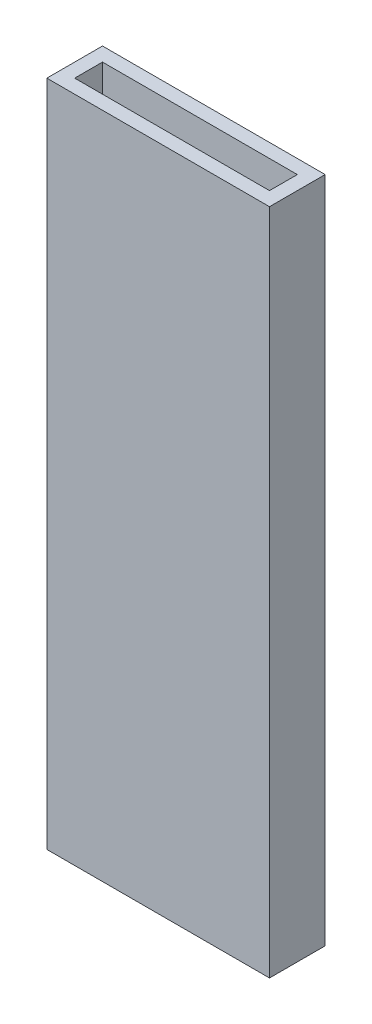
ISO-10303-21;
HEADER;
FILE_DESCRIPTION(('STEP AP214'),'2;1');
FILE_NAME('part.step','',(''),(''),'','','');
FILE_SCHEMA(('AUTOMOTIVE_DESIGN { 1 0 10303 214 1 1 1 1 }'));
ENDSEC;
DATA;
#1=APPLICATION_CONTEXT('core data for automotive mechanical design processes');
#2=APPLICATION_PROTOCOL_DEFINITION('international standard','automotive_design',2000,#1);
#3=PRODUCT_CONTEXT('',#1,'mechanical');
#4=PRODUCT('Part','Part','',(#3));
#5=PRODUCT_RELATED_PRODUCT_CATEGORY('part','',(#4));
#6=PRODUCT_DEFINITION_FORMATION('','',#4);
#7=PRODUCT_DEFINITION_CONTEXT('part definition',#1,'design');
#8=PRODUCT_DEFINITION('design','',#6,#7);
#9=PRODUCT_DEFINITION_SHAPE('','',#8);
#10=(LENGTH_UNIT() NAMED_UNIT(*) SI_UNIT(.MILLI.,.METRE.));
#11=(NAMED_UNIT(*) PLANE_ANGLE_UNIT() SI_UNIT($,.RADIAN.));
#12=(NAMED_UNIT(*) SI_UNIT($,.STERADIAN.) SOLID_ANGLE_UNIT());
#13=UNCERTAINTY_MEASURE_WITH_UNIT(LENGTH_MEASURE(1.E-05),#10,'distance_accuracy_value','');
#14=(GEOMETRIC_REPRESENTATION_CONTEXT(3) GLOBAL_UNCERTAINTY_ASSIGNED_CONTEXT((#13)) GLOBAL_UNIT_ASSIGNED_CONTEXT((#10,
#11,#12)) REPRESENTATION_CONTEXT('',''));
#15=CARTESIAN_POINT('',(0.,0.,0.));
#16=DIRECTION('',(0.,0.,1.));
#17=DIRECTION('',(1.,0.,0.));
#18=AXIS2_PLACEMENT_3D('',#15,#16,#17);
#19=CARTESIAN_POINT('',(0.,76.2,0.));
#20=DIRECTION('',(0.,-1.,0.));
#21=DIRECTION('',(0.,0.,-1.));
#22=AXIS2_PLACEMENT_3D('',#19,#20,#21);
#23=PLANE('',#22);
#24=DIRECTION('',(0.,0.,1.));
#25=VECTOR('',#24,1.);
#26=CARTESIAN_POINT('',(0.,76.2,0.));
#27=LINE('',#26,#25);
#28=CARTESIAN_POINT('',(0.,76.2,-6.35));
#29=VERTEX_POINT('',#28);
#30=CARTESIAN_POINT('',(0.,76.2,0.));
#31=VERTEX_POINT('',#30);
#32=EDGE_CURVE('E129',#29,#31,#27,.T.);
#33=ORIENTED_EDGE('',*,*,#32,.T.);
#34=DIRECTION('',(1.,0.,0.));
#35=VECTOR('',#34,1.);
#36=CARTESIAN_POINT('',(0.,76.2,0.));
#37=LINE('',#36,#35);
#38=CARTESIAN_POINT('',(25.4,76.2,0.));
#39=VERTEX_POINT('',#38);
#40=EDGE_CURVE('E132',#31,#39,#37,.T.);
#41=ORIENTED_EDGE('',*,*,#40,.T.);
#42=DIRECTION('',(0.,0.,-1.));
#43=VECTOR('',#42,1.);
#44=CARTESIAN_POINT('',(25.4,76.2,0.));
#45=LINE('',#44,#43);
#46=CARTESIAN_POINT('',(25.4,76.2,-6.35));
#47=VERTEX_POINT('',#46);
#48=EDGE_CURVE('E135',#39,#47,#45,.T.);
#49=ORIENTED_EDGE('',*,*,#48,.T.);
#50=DIRECTION('',(-1.,0.,0.));
#51=VECTOR('',#50,1.);
#52=CARTESIAN_POINT('',(0.,76.2,-6.35));
#53=LINE('',#52,#51);
#54=EDGE_CURVE('E137',#47,#29,#53,.T.);
#55=ORIENTED_EDGE('',*,*,#54,.T.);
#56=EDGE_LOOP('',(#33,#41,#49,#55));
#57=FACE_BOUND('',#56,.T.);
#58=DIRECTION('',(0.,0.,1.));
#59=VECTOR('',#58,1.);
#60=CARTESIAN_POINT('',(1.5875,76.2,0.));
#61=LINE('',#60,#59);
#62=CARTESIAN_POINT('',(1.5875,76.2,-4.7625));
#63=VERTEX_POINT('',#62);
#64=CARTESIAN_POINT('',(1.5875,76.2,-1.5875));
#65=VERTEX_POINT('',#64);
#66=EDGE_CURVE('E117',#63,#65,#61,.T.);
#67=ORIENTED_EDGE('',*,*,#66,.F.);
#68=DIRECTION('',(-1.,0.,0.));
#69=VECTOR('',#68,1.);
#70=CARTESIAN_POINT('',(0.,76.2,-4.7625));
#71=LINE('',#70,#69);
#72=CARTESIAN_POINT('',(23.8125,76.2,-4.7625));
#73=VERTEX_POINT('',#72);
#74=EDGE_CURVE('E102',#73,#63,#71,.T.);
#75=ORIENTED_EDGE('',*,*,#74,.F.);
#76=DIRECTION('',(0.,0.,-1.));
#77=VECTOR('',#76,1.);
#78=CARTESIAN_POINT('',(23.8125,76.2,0.));
#79=LINE('',#78,#77);
#80=CARTESIAN_POINT('',(23.8125,76.2,-1.5875));
#81=VERTEX_POINT('',#80);
#82=EDGE_CURVE('E126',#81,#73,#79,.T.);
#83=ORIENTED_EDGE('',*,*,#82,.F.);
#84=DIRECTION('',(1.,0.,0.));
#85=VECTOR('',#84,1.);
#86=CARTESIAN_POINT('',(0.,76.2,-1.5875));
#87=LINE('',#86,#85);
#88=EDGE_CURVE('E119',#65,#81,#87,.T.);
#89=ORIENTED_EDGE('',*,*,#88,.F.);
#90=EDGE_LOOP('',(#67,#75,#83,#89));
#91=FACE_BOUND('',#90,.T.);
#92=ADVANCED_FACE('F32',(#57,#91),#23,.F.);
#93=CARTESIAN_POINT('',(0.,0.,0.));
#94=DIRECTION('',(0.,-1.,0.));
#95=DIRECTION('',(0.,0.,-1.));
#96=AXIS2_PLACEMENT_3D('',#93,#94,#95);
#97=PLANE('',#96);
#98=DIRECTION('',(0.,0.,1.));
#99=VECTOR('',#98,1.);
#100=CARTESIAN_POINT('',(0.,0.,0.));
#101=LINE('',#100,#99);
#102=CARTESIAN_POINT('',(0.,0.,-6.35));
#103=VERTEX_POINT('',#102);
#104=CARTESIAN_POINT('',(0.,0.,0.));
#105=VERTEX_POINT('',#104);
#106=EDGE_CURVE('E140',#103,#105,#101,.T.);
#107=ORIENTED_EDGE('',*,*,#106,.F.);
#108=DIRECTION('',(-1.,0.,0.));
#109=VECTOR('',#108,1.);
#110=CARTESIAN_POINT('',(0.,0.,-6.35));
#111=LINE('',#110,#109);
#112=CARTESIAN_POINT('',(25.4,0.,-6.35));
#113=VERTEX_POINT('',#112);
#114=EDGE_CURVE('E133',#113,#103,#111,.T.);
#115=ORIENTED_EDGE('',*,*,#114,.F.);
#116=DIRECTION('',(0.,0.,-1.));
#117=VECTOR('',#116,1.);
#118=CARTESIAN_POINT('',(25.4,0.,0.));
#119=LINE('',#118,#117);
#120=CARTESIAN_POINT('',(25.4,0.,0.));
#121=VERTEX_POINT('',#120);
#122=EDGE_CURVE('E145',#121,#113,#119,.T.);
#123=ORIENTED_EDGE('',*,*,#122,.F.);
#124=DIRECTION('',(1.,0.,0.));
#125=VECTOR('',#124,1.);
#126=CARTESIAN_POINT('',(0.,0.,0.));
#127=LINE('',#126,#125);
#128=EDGE_CURVE('E143',#105,#121,#127,.T.);
#129=ORIENTED_EDGE('',*,*,#128,.F.);
#130=EDGE_LOOP('',(#107,#115,#123,#129));
#131=FACE_BOUND('',#130,.T.);
#132=DIRECTION('',(-1.,0.,0.));
#133=VECTOR('',#132,1.);
#134=CARTESIAN_POINT('',(0.,0.,-4.7625));
#135=LINE('',#134,#133);
#136=CARTESIAN_POINT('',(23.8125,0.,-4.7625));
#137=VERTEX_POINT('',#136);
#138=CARTESIAN_POINT('',(1.5875,0.,-4.7625));
#139=VERTEX_POINT('',#138);
#140=EDGE_CURVE('E100',#137,#139,#135,.T.);
#141=ORIENTED_EDGE('',*,*,#140,.T.);
#142=DIRECTION('',(0.,0.,1.));
#143=VECTOR('',#142,1.);
#144=CARTESIAN_POINT('',(1.5875,0.,0.));
#145=LINE('',#144,#143);
#146=CARTESIAN_POINT('',(1.5875,0.,-1.5875));
#147=VERTEX_POINT('',#146);
#148=EDGE_CURVE('E108',#139,#147,#145,.T.);
#149=ORIENTED_EDGE('',*,*,#148,.T.);
#150=DIRECTION('',(1.,0.,0.));
#151=VECTOR('',#150,1.);
#152=CARTESIAN_POINT('',(0.,0.,-1.5875));
#153=LINE('',#152,#151);
#154=CARTESIAN_POINT('',(23.8125,0.,-1.5875));
#155=VERTEX_POINT('',#154);
#156=EDGE_CURVE('E114',#147,#155,#153,.T.);
#157=ORIENTED_EDGE('',*,*,#156,.T.);
#158=DIRECTION('',(0.,0.,-1.));
#159=VECTOR('',#158,1.);
#160=CARTESIAN_POINT('',(23.8125,0.,0.));
#161=LINE('',#160,#159);
#162=EDGE_CURVE('E54',#155,#137,#161,.T.);
#163=ORIENTED_EDGE('',*,*,#162,.T.);
#164=EDGE_LOOP('',(#141,#149,#157,#163));
#165=FACE_BOUND('',#164,.T.);
#166=ADVANCED_FACE('F116',(#131,#165),#97,.T.);
#167=CARTESIAN_POINT('',(0.,76.2,0.));
#168=DIRECTION('',(1.,0.,0.));
#169=DIRECTION('',(0.,0.,-1.));
#170=AXIS2_PLACEMENT_3D('',#167,#168,#169);
#171=PLANE('',#170);
#172=ORIENTED_EDGE('',*,*,#106,.T.);
#173=DIRECTION('',(0.,-1.,0.));
#174=VECTOR('',#173,1.);
#175=CARTESIAN_POINT('',(0.,76.2,0.));
#176=LINE('',#175,#174);
#177=EDGE_CURVE('E11',#31,#105,#176,.T.);
#178=ORIENTED_EDGE('',*,*,#177,.F.);
#179=ORIENTED_EDGE('',*,*,#32,.F.);
#180=DIRECTION('',(0.,-1.,0.));
#181=VECTOR('',#180,1.);
#182=CARTESIAN_POINT('',(0.,76.2,-6.35));
#183=LINE('',#182,#181);
#184=EDGE_CURVE('E139',#29,#103,#183,.T.);
#185=ORIENTED_EDGE('',*,*,#184,.T.);
#186=EDGE_LOOP('',(#172,#178,#179,#185));
#187=FACE_BOUND('',#186,.T.);
#188=ADVANCED_FACE('F34',(#187),#171,.F.);
#189=CARTESIAN_POINT('',(0.,76.2,0.));
#190=DIRECTION('',(0.,0.,-1.));
#191=DIRECTION('',(-1.,0.,0.));
#192=AXIS2_PLACEMENT_3D('',#189,#190,#191);
#193=PLANE('',#192);
#194=ORIENTED_EDGE('',*,*,#128,.T.);
#195=DIRECTION('',(0.,-1.,0.));
#196=VECTOR('',#195,1.);
#197=CARTESIAN_POINT('',(25.4,76.2,0.));
#198=LINE('',#197,#196);
#199=EDGE_CURVE('E40',#39,#121,#198,.T.);
#200=ORIENTED_EDGE('',*,*,#199,.F.);
#201=ORIENTED_EDGE('',*,*,#40,.F.);
#202=ORIENTED_EDGE('',*,*,#177,.T.);
#203=EDGE_LOOP('',(#194,#200,#201,#202));
#204=FACE_BOUND('',#203,.T.);
#205=ADVANCED_FACE('F172',(#204),#193,.F.);
#206=CARTESIAN_POINT('',(25.4,76.2,0.));
#207=DIRECTION('',(-1.,0.,0.));
#208=DIRECTION('',(0.,0.,1.));
#209=AXIS2_PLACEMENT_3D('',#206,#207,#208);
#210=PLANE('',#209);
#211=ORIENTED_EDGE('',*,*,#122,.T.);
#212=DIRECTION('',(0.,-1.,0.));
#213=VECTOR('',#212,1.);
#214=CARTESIAN_POINT('',(25.4,76.2,-6.35));
#215=LINE('',#214,#213);
#216=EDGE_CURVE('E150',#47,#113,#215,.T.);
#217=ORIENTED_EDGE('',*,*,#216,.F.);
#218=ORIENTED_EDGE('',*,*,#48,.F.);
#219=ORIENTED_EDGE('',*,*,#199,.T.);
#220=EDGE_LOOP('',(#211,#217,#218,#219));
#221=FACE_BOUND('',#220,.T.);
#222=ADVANCED_FACE('F157',(#221),#210,.F.);
#223=CARTESIAN_POINT('',(0.,76.2,-6.35));
#224=DIRECTION('',(0.,0.,1.));
#225=DIRECTION('',(1.,0.,0.));
#226=AXIS2_PLACEMENT_3D('',#223,#224,#225);
#227=PLANE('',#226);
#228=ORIENTED_EDGE('',*,*,#114,.T.);
#229=ORIENTED_EDGE('',*,*,#184,.F.);
#230=ORIENTED_EDGE('',*,*,#54,.F.);
#231=ORIENTED_EDGE('',*,*,#216,.T.);
#232=EDGE_LOOP('',(#228,#229,#230,#231));
#233=FACE_BOUND('',#232,.T.);
#234=ADVANCED_FACE('F165',(#233),#227,.F.);
#235=CARTESIAN_POINT('',(1.5875,76.2,0.));
#236=DIRECTION('',(1.,0.,0.));
#237=DIRECTION('',(0.,0.,-1.));
#238=AXIS2_PLACEMENT_3D('',#235,#236,#237);
#239=PLANE('',#238);
#240=ORIENTED_EDGE('',*,*,#148,.F.);
#241=DIRECTION('',(0.,-1.,0.));
#242=VECTOR('',#241,1.);
#243=CARTESIAN_POINT('',(1.5875,76.2,-4.7625));
#244=LINE('',#243,#242);
#245=EDGE_CURVE('E96',#63,#139,#244,.T.);
#246=ORIENTED_EDGE('',*,*,#245,.F.);
#247=ORIENTED_EDGE('',*,*,#66,.T.);
#248=DIRECTION('',(0.,-1.,0.));
#249=VECTOR('',#248,1.);
#250=CARTESIAN_POINT('',(1.5875,76.2,-1.5875));
#251=LINE('',#250,#249);
#252=EDGE_CURVE('E111',#65,#147,#251,.T.);
#253=ORIENTED_EDGE('',*,*,#252,.T.);
#254=EDGE_LOOP('',(#240,#246,#247,#253));
#255=FACE_BOUND('',#254,.T.);
#256=ADVANCED_FACE('F109',(#255),#239,.T.);
#257=CARTESIAN_POINT('',(0.,76.2,-1.5875));
#258=DIRECTION('',(0.,0.,-1.));
#259=DIRECTION('',(-1.,0.,0.));
#260=AXIS2_PLACEMENT_3D('',#257,#258,#259);
#261=PLANE('',#260);
#262=ORIENTED_EDGE('',*,*,#156,.F.);
#263=ORIENTED_EDGE('',*,*,#252,.F.);
#264=ORIENTED_EDGE('',*,*,#88,.T.);
#265=DIRECTION('',(0.,-1.,0.));
#266=VECTOR('',#265,1.);
#267=CARTESIAN_POINT('',(23.8125,76.2,-1.5875));
#268=LINE('',#267,#266);
#269=EDGE_CURVE('E255',#81,#155,#268,.T.);
#270=ORIENTED_EDGE('',*,*,#269,.T.);
#271=EDGE_LOOP('',(#262,#263,#264,#270));
#272=FACE_BOUND('',#271,.T.);
#273=ADVANCED_FACE('F192',(#272),#261,.T.);
#274=CARTESIAN_POINT('',(23.8125,76.2,0.));
#275=DIRECTION('',(-1.,0.,0.));
#276=DIRECTION('',(0.,0.,1.));
#277=AXIS2_PLACEMENT_3D('',#274,#275,#276);
#278=PLANE('',#277);
#279=ORIENTED_EDGE('',*,*,#162,.F.);
#280=ORIENTED_EDGE('',*,*,#269,.F.);
#281=ORIENTED_EDGE('',*,*,#82,.T.);
#282=DIRECTION('',(0.,-1.,0.));
#283=VECTOR('',#282,1.);
#284=CARTESIAN_POINT('',(23.8125,76.2,-4.7625));
#285=LINE('',#284,#283);
#286=EDGE_CURVE('E47',#73,#137,#285,.T.);
#287=ORIENTED_EDGE('',*,*,#286,.T.);
#288=EDGE_LOOP('',(#279,#280,#281,#287));
#289=FACE_BOUND('',#288,.T.);
#290=ADVANCED_FACE('F197',(#289),#278,.T.);
#291=CARTESIAN_POINT('',(0.,76.2,-4.7625));
#292=DIRECTION('',(0.,0.,1.));
#293=DIRECTION('',(1.,0.,0.));
#294=AXIS2_PLACEMENT_3D('',#291,#292,#293);
#295=PLANE('',#294);
#296=ORIENTED_EDGE('',*,*,#140,.F.);
#297=ORIENTED_EDGE('',*,*,#286,.F.);
#298=ORIENTED_EDGE('',*,*,#74,.T.);
#299=ORIENTED_EDGE('',*,*,#245,.T.);
#300=EDGE_LOOP('',(#296,#297,#298,#299));
#301=FACE_BOUND('',#300,.T.);
#302=ADVANCED_FACE('F98',(#301),#295,.T.);
#303=CLOSED_SHELL('',(#92,#166,#188,#205,#222,#234,#256,#273,#290,#302));
#304=MANIFOLD_SOLID_BREP('B2',#303);
#305=ADVANCED_BREP_SHAPE_REPRESENTATION('',(#18,#304),#14);
#306=SHAPE_DEFINITION_REPRESENTATION(#9,#305);
ENDSEC;
END-ISO-10303-21;
